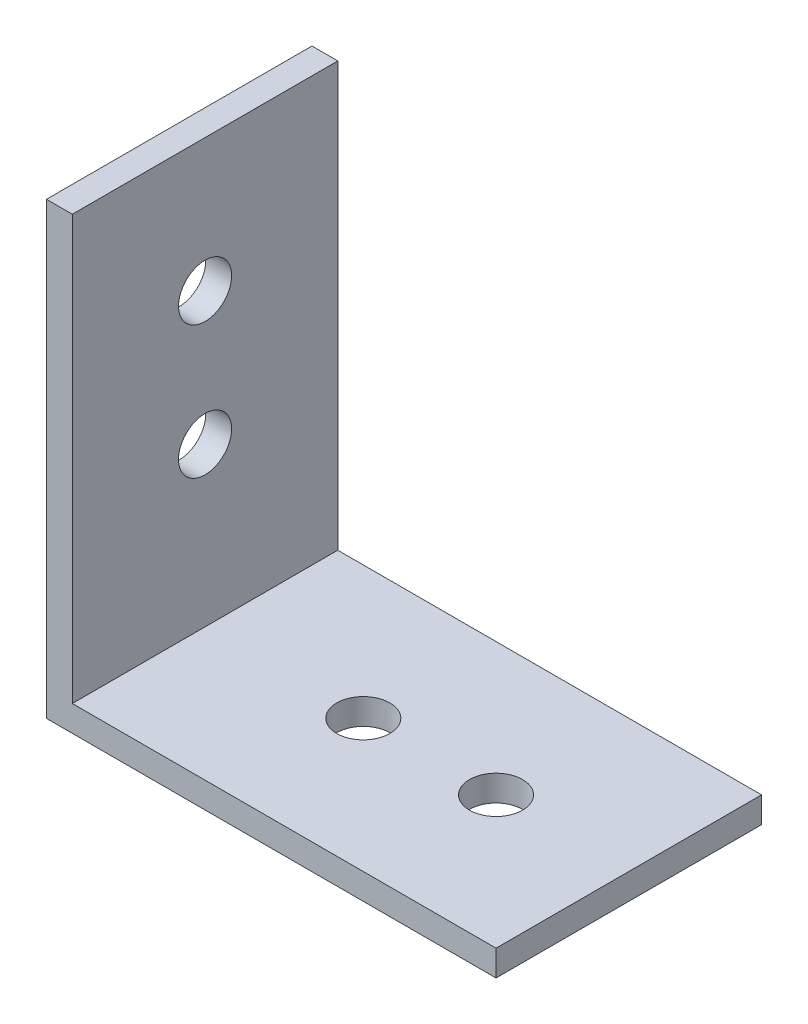
ISO-10303-21;
HEADER;
FILE_DESCRIPTION(('STEP AP214'),'2;1');
FILE_NAME('part.step','',(''),(''),'','','');
FILE_SCHEMA(('AUTOMOTIVE_DESIGN { 1 0 10303 214 1 1 1 1 }'));
ENDSEC;
DATA;
#1=APPLICATION_CONTEXT('core data for automotive mechanical design processes');
#2=APPLICATION_PROTOCOL_DEFINITION('international standard','automotive_design',2000,#1);
#3=PRODUCT_CONTEXT('',#1,'mechanical');
#4=PRODUCT('Part','Part','',(#3));
#5=PRODUCT_RELATED_PRODUCT_CATEGORY('part','',(#4));
#6=PRODUCT_DEFINITION_FORMATION('','',#4);
#7=PRODUCT_DEFINITION_CONTEXT('part definition',#1,'design');
#8=PRODUCT_DEFINITION('design','',#6,#7);
#9=PRODUCT_DEFINITION_SHAPE('','',#8);
#10=(LENGTH_UNIT() NAMED_UNIT(*) SI_UNIT(.MILLI.,.METRE.));
#11=(NAMED_UNIT(*) PLANE_ANGLE_UNIT() SI_UNIT($,.RADIAN.));
#12=(NAMED_UNIT(*) SI_UNIT($,.STERADIAN.) SOLID_ANGLE_UNIT());
#13=UNCERTAINTY_MEASURE_WITH_UNIT(LENGTH_MEASURE(1.E-05),#10,'distance_accuracy_value','');
#14=(GEOMETRIC_REPRESENTATION_CONTEXT(3) GLOBAL_UNCERTAINTY_ASSIGNED_CONTEXT((#13)) GLOBAL_UNIT_ASSIGNED_CONTEXT((#10,
#11,#12)) REPRESENTATION_CONTEXT('',''));
#15=CARTESIAN_POINT('',(0.,0.,0.));
#16=DIRECTION('',(0.,0.,1.));
#17=DIRECTION('',(1.,0.,0.));
#18=AXIS2_PLACEMENT_3D('',#15,#16,#17);
#19=CARTESIAN_POINT('',(3.175,25.4,0.));
#20=DIRECTION('',(0.,-1.,0.));
#21=DIRECTION('',(0.,0.,-1.));
#22=AXIS2_PLACEMENT_3D('',#19,#20,#21);
#23=PLANE('',#22);
#24=DIRECTION('',(0.,0.,1.));
#25=VECTOR('',#24,1.);
#26=CARTESIAN_POINT('',(1.4605,25.4,0.));
#27=LINE('',#26,#25);
#28=CARTESIAN_POINT('',(1.4605,25.4,-15.));
#29=VERTEX_POINT('',#28);
#30=CARTESIAN_POINT('',(1.4605,25.4,0.));
#31=VERTEX_POINT('',#30);
#32=EDGE_CURVE('E116',#29,#31,#27,.T.);
#33=ORIENTED_EDGE('',*,*,#32,.F.);
#34=DIRECTION('',(-1.,0.,0.));
#35=VECTOR('',#34,1.);
#36=CARTESIAN_POINT('',(3.175,25.4,-15.));
#37=LINE('',#36,#35);
#38=CARTESIAN_POINT('',(0.,25.4,-15.));
#39=VERTEX_POINT('',#38);
#40=EDGE_CURVE('E177',#29,#39,#37,.T.);
#41=ORIENTED_EDGE('',*,*,#40,.T.);
#42=DIRECTION('',(0.,0.,1.));
#43=VECTOR('',#42,1.);
#44=CARTESIAN_POINT('',(0.,25.4,0.));
#45=LINE('',#44,#43);
#46=CARTESIAN_POINT('',(0.,25.4,0.));
#47=VERTEX_POINT('',#46);
#48=EDGE_CURVE('E172',#39,#47,#45,.T.);
#49=ORIENTED_EDGE('',*,*,#48,.T.);
#50=DIRECTION('',(-1.,0.,0.));
#51=VECTOR('',#50,1.);
#52=CARTESIAN_POINT('',(3.175,25.4,0.));
#53=LINE('',#52,#51);
#54=EDGE_CURVE('E64',#31,#47,#53,.T.);
#55=ORIENTED_EDGE('',*,*,#54,.F.);
#56=EDGE_LOOP('',(#33,#41,#49,#55));
#57=FACE_BOUND('',#56,.T.);
#58=ADVANCED_FACE('F38',(#57),#23,.F.);
#59=CARTESIAN_POINT('',(0.,10.4,-7.5));
#60=DIRECTION('',(1.,0.,0.));
#61=DIRECTION('',(0.,0.,-1.));
#62=AXIS2_PLACEMENT_3D('',#59,#60,#61);
#63=CYLINDRICAL_SURFACE('',#62,1.5);
#64=CARTESIAN_POINT('',(0.,10.4,-7.5));
#65=DIRECTION('',(1.,0.,0.));
#66=DIRECTION('',(0.,0.,-1.));
#67=AXIS2_PLACEMENT_3D('',#64,#65,#66);
#68=CIRCLE('',#67,1.5);
#69=CARTESIAN_POINT('',(0.,10.4,-9.));
#70=VERTEX_POINT('',#69);
#71=EDGE_CURVE('E141',#70,#70,#68,.T.);
#72=ORIENTED_EDGE('',*,*,#71,.F.);
#73=EDGE_LOOP('',(#72));
#74=FACE_BOUND('',#73,.T.);
#75=CARTESIAN_POINT('',(1.4605,10.4,-7.5));
#76=DIRECTION('',(1.,0.,0.));
#77=DIRECTION('',(0.,0.,-1.));
#78=AXIS2_PLACEMENT_3D('',#75,#76,#77);
#79=CIRCLE('',#78,1.5);
#80=CARTESIAN_POINT('',(1.4605,10.4,-9.));
#81=VERTEX_POINT('',#80);
#82=EDGE_CURVE('E100',#81,#81,#79,.F.);
#83=ORIENTED_EDGE('',*,*,#82,.F.);
#84=EDGE_LOOP('',(#83));
#85=FACE_BOUND('',#84,.T.);
#86=ADVANCED_FACE('F199',(#74,#85),#63,.F.);
#87=CARTESIAN_POINT('',(0.,17.9,-7.5));
#88=DIRECTION('',(1.,0.,0.));
#89=DIRECTION('',(0.,0.,-1.));
#90=AXIS2_PLACEMENT_3D('',#87,#88,#89);
#91=CYLINDRICAL_SURFACE('',#90,1.5);
#92=CARTESIAN_POINT('',(0.,17.9,-7.5));
#93=DIRECTION('',(1.,0.,0.));
#94=DIRECTION('',(0.,0.,-1.));
#95=AXIS2_PLACEMENT_3D('',#92,#93,#94);
#96=CIRCLE('',#95,1.5);
#97=CARTESIAN_POINT('',(0.,17.9,-9.));
#98=VERTEX_POINT('',#97);
#99=EDGE_CURVE('E145',#98,#98,#96,.T.);
#100=ORIENTED_EDGE('',*,*,#99,.F.);
#101=EDGE_LOOP('',(#100));
#102=FACE_BOUND('',#101,.T.);
#103=CARTESIAN_POINT('',(1.4605,17.9,-7.5));
#104=DIRECTION('',(1.,0.,0.));
#105=DIRECTION('',(0.,0.,-1.));
#106=AXIS2_PLACEMENT_3D('',#103,#104,#105);
#107=CIRCLE('',#106,1.5);
#108=CARTESIAN_POINT('',(1.4605,17.9,-9.));
#109=VERTEX_POINT('',#108);
#110=EDGE_CURVE('E42',#109,#109,#107,.F.);
#111=ORIENTED_EDGE('',*,*,#110,.F.);
#112=EDGE_LOOP('',(#111));
#113=FACE_BOUND('',#112,.T.);
#114=ADVANCED_FACE('F207',(#102,#113),#91,.F.);
#115=CARTESIAN_POINT('',(3.175,0.,0.));
#116=DIRECTION('',(0.,0.,-1.));
#117=DIRECTION('',(-1.,0.,0.));
#118=AXIS2_PLACEMENT_3D('',#115,#116,#117);
#119=PLANE('',#118);
#120=DIRECTION('',(1.,0.,0.));
#121=VECTOR('',#120,1.);
#122=CARTESIAN_POINT('',(3.175,1.4605,0.));
#123=LINE('',#122,#121);
#124=CARTESIAN_POINT('',(1.4605,1.4605,0.));
#125=VERTEX_POINT('',#124);
#126=CARTESIAN_POINT('',(25.4,1.4605,0.));
#127=VERTEX_POINT('',#126);
#128=EDGE_CURVE('E56',#125,#127,#123,.T.);
#129=ORIENTED_EDGE('',*,*,#128,.F.);
#130=DIRECTION('',(0.,-1.,0.));
#131=VECTOR('',#130,1.);
#132=CARTESIAN_POINT('',(1.4605,25.4,0.));
#133=LINE('',#132,#131);
#134=EDGE_CURVE('E95',#31,#125,#133,.T.);
#135=ORIENTED_EDGE('',*,*,#134,.F.);
#136=ORIENTED_EDGE('',*,*,#54,.T.);
#137=DIRECTION('',(0.,-1.,0.));
#138=VECTOR('',#137,1.);
#139=CARTESIAN_POINT('',(0.,0.,0.));
#140=LINE('',#139,#138);
#141=CARTESIAN_POINT('',(0.,0.,0.));
#142=VERTEX_POINT('',#141);
#143=EDGE_CURVE('E162',#47,#142,#140,.T.);
#144=ORIENTED_EDGE('',*,*,#143,.T.);
#145=DIRECTION('',(-1.,0.,0.));
#146=VECTOR('',#145,1.);
#147=CARTESIAN_POINT('',(3.175,0.,0.));
#148=LINE('',#147,#146);
#149=CARTESIAN_POINT('',(25.4,0.,0.));
#150=VERTEX_POINT('',#149);
#151=EDGE_CURVE('E11',#150,#142,#148,.T.);
#152=ORIENTED_EDGE('',*,*,#151,.F.);
#153=DIRECTION('',(0.,-1.,0.));
#154=VECTOR('',#153,1.);
#155=CARTESIAN_POINT('',(25.4,0.,0.));
#156=LINE('',#155,#154);
#157=EDGE_CURVE('E97',#127,#150,#156,.T.);
#158=ORIENTED_EDGE('',*,*,#157,.F.);
#159=EDGE_LOOP('',(#129,#135,#136,#144,#152,#158));
#160=FACE_BOUND('',#159,.T.);
#161=ADVANCED_FACE('F40',(#160),#119,.F.);
#162=CARTESIAN_POINT('',(3.175,0.,0.));
#163=DIRECTION('',(0.,1.,0.));
#164=DIRECTION('',(0.,0.,1.));
#165=AXIS2_PLACEMENT_3D('',#162,#163,#164);
#166=PLANE('',#165);
#167=CARTESIAN_POINT('',(10.4,0.,-7.5));
#168=DIRECTION('',(0.,-1.,0.));
#169=DIRECTION('',(0.,0.,-1.));
#170=AXIS2_PLACEMENT_3D('',#167,#168,#169);
#171=CIRCLE('',#170,1.5);
#172=CARTESIAN_POINT('',(10.4,0.,-9.));
#173=VERTEX_POINT('',#172);
#174=EDGE_CURVE('E137',#173,#173,#171,.T.);
#175=ORIENTED_EDGE('',*,*,#174,.F.);
#176=EDGE_LOOP('',(#175));
#177=FACE_BOUND('',#176,.T.);
#178=CARTESIAN_POINT('',(17.9,0.,-7.5));
#179=DIRECTION('',(0.,-1.,0.));
#180=DIRECTION('',(0.,0.,-1.));
#181=AXIS2_PLACEMENT_3D('',#178,#179,#180);
#182=CIRCLE('',#181,1.5);
#183=CARTESIAN_POINT('',(17.9,0.,-9.));
#184=VERTEX_POINT('',#183);
#185=EDGE_CURVE('E136',#184,#184,#182,.T.);
#186=ORIENTED_EDGE('',*,*,#185,.F.);
#187=EDGE_LOOP('',(#186));
#188=FACE_BOUND('',#187,.T.);
#189=DIRECTION('',(0.,0.,-1.));
#190=VECTOR('',#189,1.);
#191=CARTESIAN_POINT('',(0.,0.,0.));
#192=LINE('',#191,#190);
#193=CARTESIAN_POINT('',(0.,0.,-15.));
#194=VERTEX_POINT('',#193);
#195=EDGE_CURVE('E165',#142,#194,#192,.T.);
#196=ORIENTED_EDGE('',*,*,#195,.T.);
#197=DIRECTION('',(-1.,0.,0.));
#198=VECTOR('',#197,1.);
#199=CARTESIAN_POINT('',(3.175,0.,-15.));
#200=LINE('',#199,#198);
#201=CARTESIAN_POINT('',(25.4,0.,-15.));
#202=VERTEX_POINT('',#201);
#203=EDGE_CURVE('E48',#202,#194,#200,.T.);
#204=ORIENTED_EDGE('',*,*,#203,.F.);
#205=DIRECTION('',(0.,0.,-1.));
#206=VECTOR('',#205,1.);
#207=CARTESIAN_POINT('',(25.4,0.,0.));
#208=LINE('',#207,#206);
#209=EDGE_CURVE('E154',#150,#202,#208,.T.);
#210=ORIENTED_EDGE('',*,*,#209,.F.);
#211=ORIENTED_EDGE('',*,*,#151,.T.);
#212=EDGE_LOOP('',(#196,#204,#210,#211));
#213=FACE_BOUND('',#212,.T.);
#214=ADVANCED_FACE('F216',(#177,#188,#213),#166,.F.);
#215=CARTESIAN_POINT('',(3.175,0.,-15.));
#216=DIRECTION('',(0.,0.,1.));
#217=DIRECTION('',(1.,0.,0.));
#218=AXIS2_PLACEMENT_3D('',#215,#216,#217);
#219=PLANE('',#218);
#220=DIRECTION('',(0.,1.,0.));
#221=VECTOR('',#220,1.);
#222=CARTESIAN_POINT('',(1.4605,25.4,-15.));
#223=LINE('',#222,#221);
#224=CARTESIAN_POINT('',(1.4605,1.4605,-15.));
#225=VERTEX_POINT('',#224);
#226=EDGE_CURVE('E111',#225,#29,#223,.T.);
#227=ORIENTED_EDGE('',*,*,#226,.F.);
#228=DIRECTION('',(-1.,0.,0.));
#229=VECTOR('',#228,1.);
#230=CARTESIAN_POINT('',(3.175,1.4605,-15.));
#231=LINE('',#230,#229);
#232=CARTESIAN_POINT('',(25.4,1.4605,-15.));
#233=VERTEX_POINT('',#232);
#234=EDGE_CURVE('E107',#233,#225,#231,.T.);
#235=ORIENTED_EDGE('',*,*,#234,.F.);
#236=DIRECTION('',(0.,1.,0.));
#237=VECTOR('',#236,1.);
#238=CARTESIAN_POINT('',(25.4,0.,-15.));
#239=LINE('',#238,#237);
#240=EDGE_CURVE('E158',#202,#233,#239,.T.);
#241=ORIENTED_EDGE('',*,*,#240,.F.);
#242=ORIENTED_EDGE('',*,*,#203,.T.);
#243=DIRECTION('',(0.,1.,0.));
#244=VECTOR('',#243,1.);
#245=CARTESIAN_POINT('',(0.,0.,-15.));
#246=LINE('',#245,#244);
#247=EDGE_CURVE('E168',#194,#39,#246,.T.);
#248=ORIENTED_EDGE('',*,*,#247,.T.);
#249=ORIENTED_EDGE('',*,*,#40,.F.);
#250=EDGE_LOOP('',(#227,#235,#241,#242,#248,#249));
#251=FACE_BOUND('',#250,.T.);
#252=ADVANCED_FACE('F214',(#251),#219,.F.);
#253=CARTESIAN_POINT('',(0.,0.,0.));
#254=DIRECTION('',(-1.,0.,0.));
#255=DIRECTION('',(0.,0.,1.));
#256=AXIS2_PLACEMENT_3D('',#253,#254,#255);
#257=PLANE('',#256);
#258=ORIENTED_EDGE('',*,*,#99,.T.);
#259=EDGE_LOOP('',(#258));
#260=FACE_BOUND('',#259,.T.);
#261=ORIENTED_EDGE('',*,*,#71,.T.);
#262=EDGE_LOOP('',(#261));
#263=FACE_BOUND('',#262,.T.);
#264=ORIENTED_EDGE('',*,*,#143,.F.);
#265=ORIENTED_EDGE('',*,*,#48,.F.);
#266=ORIENTED_EDGE('',*,*,#247,.F.);
#267=ORIENTED_EDGE('',*,*,#195,.F.);
#268=EDGE_LOOP('',(#264,#265,#266,#267));
#269=FACE_BOUND('',#268,.T.);
#270=ADVANCED_FACE('F212',(#260,#263,#269),#257,.T.);
#271=CARTESIAN_POINT('',(25.4,0.,0.));
#272=DIRECTION('',(-1.,0.,0.));
#273=DIRECTION('',(0.,0.,1.));
#274=AXIS2_PLACEMENT_3D('',#271,#272,#273);
#275=PLANE('',#274);
#276=ORIENTED_EDGE('',*,*,#240,.T.);
#277=DIRECTION('',(0.,0.,-1.));
#278=VECTOR('',#277,1.);
#279=CARTESIAN_POINT('',(25.4,1.4605,0.));
#280=LINE('',#279,#278);
#281=EDGE_CURVE('E99',#127,#233,#280,.T.);
#282=ORIENTED_EDGE('',*,*,#281,.F.);
#283=ORIENTED_EDGE('',*,*,#157,.T.);
#284=ORIENTED_EDGE('',*,*,#209,.T.);
#285=EDGE_LOOP('',(#276,#282,#283,#284));
#286=FACE_BOUND('',#285,.T.);
#287=ADVANCED_FACE('F237',(#286),#275,.F.);
#288=CARTESIAN_POINT('',(17.9,25.4,-7.5));
#289=DIRECTION('',(0.,-1.,0.));
#290=DIRECTION('',(0.,0.,-1.));
#291=AXIS2_PLACEMENT_3D('',#288,#289,#290);
#292=CYLINDRICAL_SURFACE('',#291,1.5);
#293=CARTESIAN_POINT('',(17.9,1.4605,-7.5));
#294=DIRECTION('',(0.,-1.,0.));
#295=DIRECTION('',(0.,0.,-1.));
#296=AXIS2_PLACEMENT_3D('',#293,#294,#295);
#297=CIRCLE('',#296,1.5);
#298=CARTESIAN_POINT('',(17.9,1.4605,-9.));
#299=VERTEX_POINT('',#298);
#300=EDGE_CURVE('E132',#299,#299,#297,.F.);
#301=ORIENTED_EDGE('',*,*,#300,.T.);
#302=EDGE_LOOP('',(#301));
#303=FACE_BOUND('',#302,.T.);
#304=ORIENTED_EDGE('',*,*,#185,.T.);
#305=EDGE_LOOP('',(#304));
#306=FACE_BOUND('',#305,.T.);
#307=ADVANCED_FACE('F196',(#303,#306),#292,.F.);
#308=CARTESIAN_POINT('',(10.4,25.4,-7.5));
#309=DIRECTION('',(0.,-1.,0.));
#310=DIRECTION('',(0.,0.,-1.));
#311=AXIS2_PLACEMENT_3D('',#308,#309,#310);
#312=CYLINDRICAL_SURFACE('',#311,1.5);
#313=CARTESIAN_POINT('',(10.4,1.4605,-7.5));
#314=DIRECTION('',(0.,-1.,0.));
#315=DIRECTION('',(0.,0.,-1.));
#316=AXIS2_PLACEMENT_3D('',#313,#314,#315);
#317=CIRCLE('',#316,1.5);
#318=CARTESIAN_POINT('',(10.4,1.4605,-9.));
#319=VERTEX_POINT('',#318);
#320=EDGE_CURVE('E131',#319,#319,#317,.F.);
#321=ORIENTED_EDGE('',*,*,#320,.T.);
#322=EDGE_LOOP('',(#321));
#323=FACE_BOUND('',#322,.T.);
#324=ORIENTED_EDGE('',*,*,#174,.T.);
#325=EDGE_LOOP('',(#324));
#326=FACE_BOUND('',#325,.T.);
#327=ADVANCED_FACE('F186',(#323,#326),#312,.F.);
#328=CARTESIAN_POINT('',(0.,1.4605,0.));
#329=DIRECTION('',(0.,-1.,0.));
#330=DIRECTION('',(0.,0.,-1.));
#331=AXIS2_PLACEMENT_3D('',#328,#329,#330);
#332=PLANE('',#331);
#333=ORIENTED_EDGE('',*,*,#320,.F.);
#334=EDGE_LOOP('',(#333));
#335=FACE_BOUND('',#334,.T.);
#336=ORIENTED_EDGE('',*,*,#234,.T.);
#337=DIRECTION('',(0.,0.,-1.));
#338=VECTOR('',#337,1.);
#339=CARTESIAN_POINT('',(1.4605,1.4605,0.));
#340=LINE('',#339,#338);
#341=EDGE_CURVE('E103',#125,#225,#340,.T.);
#342=ORIENTED_EDGE('',*,*,#341,.F.);
#343=ORIENTED_EDGE('',*,*,#128,.T.);
#344=ORIENTED_EDGE('',*,*,#281,.T.);
#345=EDGE_LOOP('',(#336,#342,#343,#344));
#346=FACE_BOUND('',#345,.T.);
#347=ORIENTED_EDGE('',*,*,#300,.F.);
#348=EDGE_LOOP('',(#347));
#349=FACE_BOUND('',#348,.T.);
#350=ADVANCED_FACE('F104',(#335,#346,#349),#332,.F.);
#351=CARTESIAN_POINT('',(1.4605,0.,0.));
#352=DIRECTION('',(1.,0.,0.));
#353=DIRECTION('',(0.,0.,-1.));
#354=AXIS2_PLACEMENT_3D('',#351,#352,#353);
#355=PLANE('',#354);
#356=ORIENTED_EDGE('',*,*,#134,.T.);
#357=ORIENTED_EDGE('',*,*,#341,.T.);
#358=ORIENTED_EDGE('',*,*,#226,.T.);
#359=ORIENTED_EDGE('',*,*,#32,.T.);
#360=EDGE_LOOP('',(#356,#357,#358,#359));
#361=FACE_BOUND('',#360,.T.);
#362=ORIENTED_EDGE('',*,*,#110,.T.);
#363=EDGE_LOOP('',(#362));
#364=FACE_BOUND('',#363,.T.);
#365=ORIENTED_EDGE('',*,*,#82,.T.);
#366=EDGE_LOOP('',(#365));
#367=FACE_BOUND('',#366,.T.);
#368=ADVANCED_FACE('F113',(#361,#364,#367),#355,.T.);
#369=CLOSED_SHELL('',(#58,#86,#114,#161,#214,#252,#270,#287,#307,#327,#350,#368));
#370=MANIFOLD_SOLID_BREP('B2',#369);
#371=ADVANCED_BREP_SHAPE_REPRESENTATION('',(#18,#370),#14);
#372=SHAPE_DEFINITION_REPRESENTATION(#9,#371);
ENDSEC;
END-ISO-10303-21;
